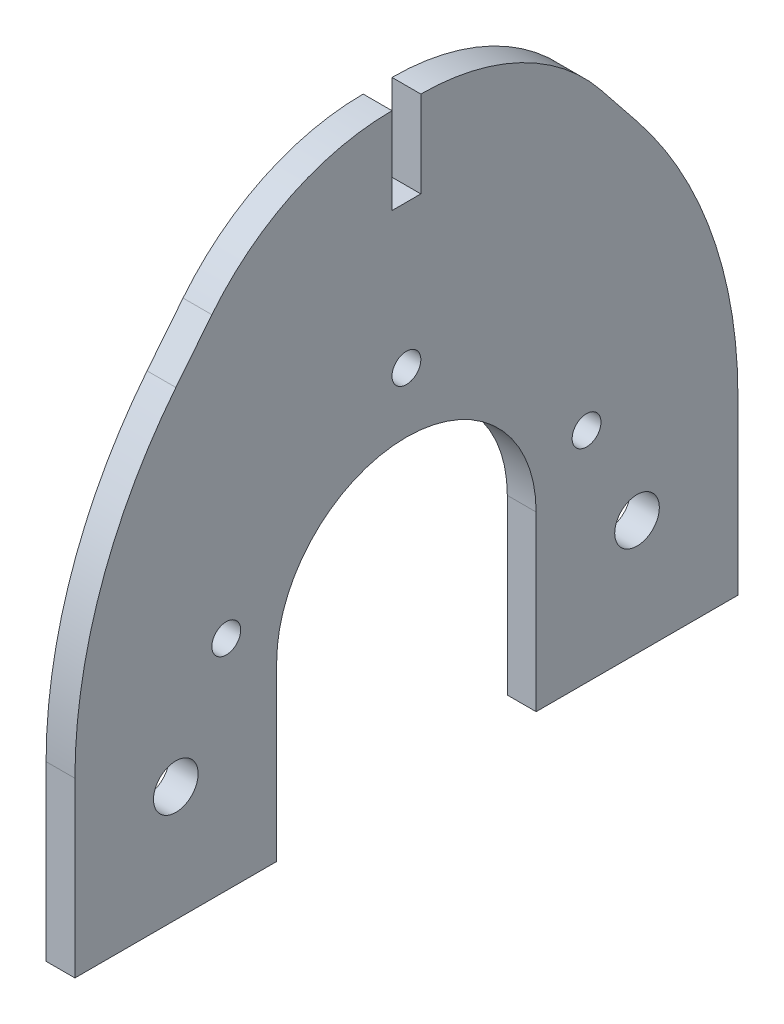
ISO-10303-21;
HEADER;
FILE_DESCRIPTION(('STEP AP214'),'2;1');
FILE_NAME('part.step','',(''),(''),'','','');
FILE_SCHEMA(('AUTOMOTIVE_DESIGN { 1 0 10303 214 1 1 1 1 }'));
ENDSEC;
DATA;
#1=APPLICATION_CONTEXT('core data for automotive mechanical design processes');
#2=APPLICATION_PROTOCOL_DEFINITION('international standard','automotive_design',2000,#1);
#3=PRODUCT_CONTEXT('',#1,'mechanical');
#4=PRODUCT('Part','Part','',(#3));
#5=PRODUCT_RELATED_PRODUCT_CATEGORY('part','',(#4));
#6=PRODUCT_DEFINITION_FORMATION('','',#4);
#7=PRODUCT_DEFINITION_CONTEXT('part definition',#1,'design');
#8=PRODUCT_DEFINITION('design','',#6,#7);
#9=PRODUCT_DEFINITION_SHAPE('','',#8);
#10=(LENGTH_UNIT() NAMED_UNIT(*) SI_UNIT(.MILLI.,.METRE.));
#11=(NAMED_UNIT(*) PLANE_ANGLE_UNIT() SI_UNIT($,.RADIAN.));
#12=(NAMED_UNIT(*) SI_UNIT($,.STERADIAN.) SOLID_ANGLE_UNIT());
#13=UNCERTAINTY_MEASURE_WITH_UNIT(LENGTH_MEASURE(1.E-05),#10,'distance_accuracy_value','');
#14=(GEOMETRIC_REPRESENTATION_CONTEXT(3) GLOBAL_UNCERTAINTY_ASSIGNED_CONTEXT((#13)) GLOBAL_UNIT_ASSIGNED_CONTEXT((#10,
#11,#12)) REPRESENTATION_CONTEXT('',''));
#15=CARTESIAN_POINT('',(0.,0.,0.));
#16=DIRECTION('',(0.,0.,1.));
#17=DIRECTION('',(1.,0.,0.));
#18=AXIS2_PLACEMENT_3D('',#15,#16,#17);
#19=CARTESIAN_POINT('',(3.175,0.,0.));
#20=DIRECTION('',(-1.,0.,0.));
#21=DIRECTION('',(0.,0.,1.));
#22=AXIS2_PLACEMENT_3D('',#19,#20,#21);
#23=CYLINDRICAL_SURFACE('',#22,14.2875);
#24=CARTESIAN_POINT('',(0.,0.,0.));
#25=DIRECTION('',(-1.,0.,0.));
#26=DIRECTION('',(0.,0.,-1.));
#27=AXIS2_PLACEMENT_3D('',#24,#25,#26);
#28=CIRCLE('',#27,14.2875);
#29=CARTESIAN_POINT('',(0.,0.,14.2875));
#30=VERTEX_POINT('',#29);
#31=CARTESIAN_POINT('',(0.,0.,-14.2875));
#32=VERTEX_POINT('',#31);
#33=EDGE_CURVE('E181',#30,#32,#28,.T.);
#34=ORIENTED_EDGE('',*,*,#33,.T.);
#35=DIRECTION('',(-1.,0.,0.));
#36=VECTOR('',#35,1.);
#37=CARTESIAN_POINT('',(3.175,0.,-14.2875));
#38=LINE('',#37,#36);
#39=CARTESIAN_POINT('',(3.175,0.,-14.2875));
#40=VERTEX_POINT('',#39);
#41=EDGE_CURVE('E11',#40,#32,#38,.T.);
#42=ORIENTED_EDGE('',*,*,#41,.F.);
#43=CARTESIAN_POINT('',(3.175,0.,0.));
#44=DIRECTION('',(-1.,0.,0.));
#45=DIRECTION('',(0.,0.,-1.));
#46=AXIS2_PLACEMENT_3D('',#43,#44,#45);
#47=CIRCLE('',#46,14.2875);
#48=CARTESIAN_POINT('',(3.175,0.,14.2875));
#49=VERTEX_POINT('',#48);
#50=EDGE_CURVE('E212',#49,#40,#47,.T.);
#51=ORIENTED_EDGE('',*,*,#50,.F.);
#52=DIRECTION('',(-1.,0.,0.));
#53=VECTOR('',#52,1.);
#54=CARTESIAN_POINT('',(3.175,0.,14.2875));
#55=LINE('',#54,#53);
#56=EDGE_CURVE('E177',#49,#30,#55,.T.);
#57=ORIENTED_EDGE('',*,*,#56,.T.);
#58=EDGE_LOOP('',(#34,#42,#51,#57));
#59=FACE_BOUND('',#58,.T.);
#60=ADVANCED_FACE('F37',(#59),#23,.F.);
#61=CARTESIAN_POINT('',(3.175,-19.05,-14.2875));
#62=DIRECTION('',(0.,0.,-1.));
#63=DIRECTION('',(-1.,0.,0.));
#64=AXIS2_PLACEMENT_3D('',#61,#62,#63);
#65=PLANE('',#64);
#66=DIRECTION('',(0.,-1.,0.));
#67=VECTOR('',#66,1.);
#68=CARTESIAN_POINT('',(0.,-19.05,-14.2875));
#69=LINE('',#68,#67);
#70=CARTESIAN_POINT('',(0.,-19.05,-14.2875));
#71=VERTEX_POINT('',#70);
#72=EDGE_CURVE('E184',#32,#71,#69,.T.);
#73=ORIENTED_EDGE('',*,*,#72,.T.);
#74=DIRECTION('',(-1.,0.,0.));
#75=VECTOR('',#74,1.);
#76=CARTESIAN_POINT('',(3.175,-19.05,-14.2875));
#77=LINE('',#76,#75);
#78=CARTESIAN_POINT('',(3.175,-19.05,-14.2875));
#79=VERTEX_POINT('',#78);
#80=EDGE_CURVE('E45',#79,#71,#77,.T.);
#81=ORIENTED_EDGE('',*,*,#80,.F.);
#82=DIRECTION('',(0.,-1.,0.));
#83=VECTOR('',#82,1.);
#84=CARTESIAN_POINT('',(3.175,-19.05,-14.2875));
#85=LINE('',#84,#83);
#86=EDGE_CURVE('E120',#40,#79,#85,.T.);
#87=ORIENTED_EDGE('',*,*,#86,.F.);
#88=ORIENTED_EDGE('',*,*,#41,.T.);
#89=EDGE_LOOP('',(#73,#81,#87,#88));
#90=FACE_BOUND('',#89,.T.);
#91=ADVANCED_FACE('F311',(#90),#65,.F.);
#92=CARTESIAN_POINT('',(3.175,-19.05,-36.5125));
#93=DIRECTION('',(0.,1.,0.));
#94=DIRECTION('',(0.,0.,1.));
#95=AXIS2_PLACEMENT_3D('',#92,#93,#94);
#96=PLANE('',#95);
#97=DIRECTION('',(0.,0.,-1.));
#98=VECTOR('',#97,1.);
#99=CARTESIAN_POINT('',(0.,-19.05,-36.5125));
#100=LINE('',#99,#98);
#101=CARTESIAN_POINT('',(0.,-19.05,-36.5125));
#102=VERTEX_POINT('',#101);
#103=EDGE_CURVE('E187',#71,#102,#100,.T.);
#104=ORIENTED_EDGE('',*,*,#103,.T.);
#105=DIRECTION('',(-1.,0.,0.));
#106=VECTOR('',#105,1.);
#107=CARTESIAN_POINT('',(3.175,-19.05,-36.5125));
#108=LINE('',#107,#106);
#109=CARTESIAN_POINT('',(3.175,-19.05,-36.5125));
#110=VERTEX_POINT('',#109);
#111=EDGE_CURVE('E243',#110,#102,#108,.T.);
#112=ORIENTED_EDGE('',*,*,#111,.F.);
#113=DIRECTION('',(0.,0.,-1.));
#114=VECTOR('',#113,1.);
#115=CARTESIAN_POINT('',(3.175,-19.05,-36.5125));
#116=LINE('',#115,#114);
#117=EDGE_CURVE('E251',#79,#110,#116,.T.);
#118=ORIENTED_EDGE('',*,*,#117,.F.);
#119=ORIENTED_EDGE('',*,*,#80,.T.);
#120=EDGE_LOOP('',(#104,#112,#118,#119));
#121=FACE_BOUND('',#120,.T.);
#122=ADVANCED_FACE('F249',(#121),#96,.F.);
#123=CARTESIAN_POINT('',(3.175,0.,-36.5125));
#124=DIRECTION('',(0.,0.,1.));
#125=DIRECTION('',(1.,0.,0.));
#126=AXIS2_PLACEMENT_3D('',#123,#124,#125);
#127=PLANE('',#126);
#128=DIRECTION('',(0.,1.,0.));
#129=VECTOR('',#128,1.);
#130=CARTESIAN_POINT('',(0.,0.,-36.5125));
#131=LINE('',#130,#129);
#132=CARTESIAN_POINT('',(0.,0.,-36.5125));
#133=VERTEX_POINT('',#132);
#134=EDGE_CURVE('E189',#102,#133,#131,.T.);
#135=ORIENTED_EDGE('',*,*,#134,.T.);
#136=DIRECTION('',(-1.,0.,0.));
#137=VECTOR('',#136,1.);
#138=CARTESIAN_POINT('',(3.175,0.,-36.5125));
#139=LINE('',#138,#137);
#140=CARTESIAN_POINT('',(3.175,0.,-36.5125));
#141=VERTEX_POINT('',#140);
#142=EDGE_CURVE('E240',#141,#133,#139,.T.);
#143=ORIENTED_EDGE('',*,*,#142,.F.);
#144=DIRECTION('',(0.,1.,0.));
#145=VECTOR('',#144,1.);
#146=CARTESIAN_POINT('',(3.175,0.,-36.5125));
#147=LINE('',#146,#145);
#148=EDGE_CURVE('E269',#110,#141,#147,.T.);
#149=ORIENTED_EDGE('',*,*,#148,.F.);
#150=ORIENTED_EDGE('',*,*,#111,.T.);
#151=EDGE_LOOP('',(#135,#143,#149,#150));
#152=FACE_BOUND('',#151,.T.);
#153=ADVANCED_FACE('F260',(#152),#127,.F.);
#154=CARTESIAN_POINT('',(3.175,0.,14.2875));
#155=DIRECTION('',(-1.,0.,0.));
#156=DIRECTION('',(0.,0.,1.));
#157=AXIS2_PLACEMENT_3D('',#154,#155,#156);
#158=CYLINDRICAL_SURFACE('',#157,50.8);
#159=CARTESIAN_POINT('',(0.,0.,14.2875));
#160=DIRECTION('',(1.,0.,0.));
#161=DIRECTION('',(0.,0.,-1.));
#162=AXIS2_PLACEMENT_3D('',#159,#160,#161);
#163=CIRCLE('',#162,50.8);
#164=CARTESIAN_POINT('',(0.,31.7197502393578,-25.3924375598395));
#165=VERTEX_POINT('',#164);
#166=EDGE_CURVE('E191',#133,#165,#163,.T.);
#167=ORIENTED_EDGE('',*,*,#166,.T.);
#168=DIRECTION('',(-1.,0.,0.));
#169=VECTOR('',#168,1.);
#170=CARTESIAN_POINT('',(3.175,31.7197502393578,-25.3924375598395));
#171=LINE('',#170,#169);
#172=CARTESIAN_POINT('',(3.175,31.7197502393578,-25.3924375598395));
#173=VERTEX_POINT('',#172);
#174=EDGE_CURVE('E237',#173,#165,#171,.T.);
#175=ORIENTED_EDGE('',*,*,#174,.F.);
#176=CARTESIAN_POINT('',(3.175,0.,14.2875));
#177=DIRECTION('',(1.,0.,0.));
#178=DIRECTION('',(0.,0.,-1.));
#179=AXIS2_PLACEMENT_3D('',#176,#177,#178);
#180=CIRCLE('',#179,50.8);
#181=EDGE_CURVE('E266',#141,#173,#180,.T.);
#182=ORIENTED_EDGE('',*,*,#181,.F.);
#183=ORIENTED_EDGE('',*,*,#142,.T.);
#184=EDGE_LOOP('',(#167,#175,#182,#183));
#185=FACE_BOUND('',#184,.T.);
#186=ADVANCED_FACE('F264',(#185),#158,.T.);
#187=CARTESIAN_POINT('',(3.175,36.6797424343378,-21.4274687799197));
#188=DIRECTION('',(0.,-0.624404532270824,0.781101133067706));
#189=DIRECTION('',(0.,-0.781101133067706,-0.624404532270824));
#190=AXIS2_PLACEMENT_3D('',#187,#188,#189);
#191=PLANE('',#190);
#192=DIRECTION('',(0.,0.781101133067706,0.624404532270824));
#193=VECTOR('',#192,1.);
#194=CARTESIAN_POINT('',(0.,36.6797424343378,-21.4274687799197));
#195=LINE('',#194,#193);
#196=CARTESIAN_POINT('',(0.,36.6797424343378,-21.4274687799197));
#197=VERTEX_POINT('',#196);
#198=EDGE_CURVE('E193',#165,#197,#195,.T.);
#199=ORIENTED_EDGE('',*,*,#198,.T.);
#200=DIRECTION('',(-1.,0.,0.));
#201=VECTOR('',#200,1.);
#202=CARTESIAN_POINT('',(3.175,36.6797424343378,-21.4274687799197));
#203=LINE('',#202,#201);
#204=CARTESIAN_POINT('',(3.175,36.6797424343378,-21.4274687799197));
#205=VERTEX_POINT('',#204);
#206=EDGE_CURVE('E234',#205,#197,#203,.T.);
#207=ORIENTED_EDGE('',*,*,#206,.F.);
#208=DIRECTION('',(0.,0.781101133067706,0.624404532270824));
#209=VECTOR('',#208,1.);
#210=CARTESIAN_POINT('',(3.175,36.6797424343378,-21.4274687799197));
#211=LINE('',#210,#209);
#212=EDGE_CURVE('E268',#173,#205,#211,.T.);
#213=ORIENTED_EDGE('',*,*,#212,.F.);
#214=ORIENTED_EDGE('',*,*,#174,.T.);
#215=EDGE_LOOP('',(#199,#207,#213,#214));
#216=FACE_BOUND('',#215,.T.);
#217=ADVANCED_FACE('F324',(#216),#191,.F.);
#218=CARTESIAN_POINT('',(3.175,20.8198673146589,-1.5875));
#219=DIRECTION('',(-1.,0.,0.));
#220=DIRECTION('',(0.,0.,1.));
#221=AXIS2_PLACEMENT_3D('',#218,#219,#220);
#222=CYLINDRICAL_SURFACE('',#221,25.4);
#223=CARTESIAN_POINT('',(0.,20.8198673146589,-1.5875));
#224=DIRECTION('',(1.,0.,0.));
#225=DIRECTION('',(0.,0.,-1.));
#226=AXIS2_PLACEMENT_3D('',#223,#224,#225);
#227=CIRCLE('',#226,25.4);
#228=CARTESIAN_POINT('',(0.,46.2198673146588,-1.5875));
#229=VERTEX_POINT('',#228);
#230=EDGE_CURVE('E195',#197,#229,#227,.T.);
#231=ORIENTED_EDGE('',*,*,#230,.T.);
#232=DIRECTION('',(-1.,0.,0.));
#233=VECTOR('',#232,1.);
#234=CARTESIAN_POINT('',(3.175,46.2198673146588,-1.5875));
#235=LINE('',#234,#233);
#236=CARTESIAN_POINT('',(3.175,46.2198673146588,-1.5875));
#237=VERTEX_POINT('',#236);
#238=EDGE_CURVE('E231',#237,#229,#235,.T.);
#239=ORIENTED_EDGE('',*,*,#238,.F.);
#240=CARTESIAN_POINT('',(3.175,20.8198673146589,-1.5875));
#241=DIRECTION('',(1.,0.,0.));
#242=DIRECTION('',(0.,0.,-1.));
#243=AXIS2_PLACEMENT_3D('',#240,#241,#242);
#244=CIRCLE('',#243,25.4);
#245=EDGE_CURVE('E271',#205,#237,#244,.T.);
#246=ORIENTED_EDGE('',*,*,#245,.F.);
#247=ORIENTED_EDGE('',*,*,#206,.T.);
#248=EDGE_LOOP('',(#231,#239,#246,#247));
#249=FACE_BOUND('',#248,.T.);
#250=ADVANCED_FACE('F327',(#249),#222,.T.);
#251=CARTESIAN_POINT('',(3.175,46.2198673146588,-1.5875));
#252=DIRECTION('',(0.,0.,-1.));
#253=DIRECTION('',(0.,1.,0.));
#254=AXIS2_PLACEMENT_3D('',#251,#252,#253);
#255=PLANE('',#254);
#256=DIRECTION('',(0.,-1.,0.));
#257=VECTOR('',#256,1.);
#258=CARTESIAN_POINT('',(0.,46.2198673146588,-1.5875));
#259=LINE('',#258,#257);
#260=CARTESIAN_POINT('',(0.,36.6948673146588,-1.5875));
#261=VERTEX_POINT('',#260);
#262=EDGE_CURVE('E197',#229,#261,#259,.T.);
#263=ORIENTED_EDGE('',*,*,#262,.T.);
#264=DIRECTION('',(-1.,0.,0.));
#265=VECTOR('',#264,1.);
#266=CARTESIAN_POINT('',(3.175,36.6948673146588,-1.5875));
#267=LINE('',#266,#265);
#268=CARTESIAN_POINT('',(3.175,36.6948673146588,-1.5875));
#269=VERTEX_POINT('',#268);
#270=EDGE_CURVE('E228',#269,#261,#267,.T.);
#271=ORIENTED_EDGE('',*,*,#270,.F.);
#272=DIRECTION('',(0.,-1.,0.));
#273=VECTOR('',#272,1.);
#274=CARTESIAN_POINT('',(3.175,46.2198673146588,-1.5875));
#275=LINE('',#274,#273);
#276=EDGE_CURVE('E277',#237,#269,#275,.T.);
#277=ORIENTED_EDGE('',*,*,#276,.F.);
#278=ORIENTED_EDGE('',*,*,#238,.T.);
#279=EDGE_LOOP('',(#263,#271,#277,#278));
#280=FACE_BOUND('',#279,.T.);
#281=ADVANCED_FACE('F331',(#280),#255,.F.);
#282=CARTESIAN_POINT('',(3.175,36.6948673146588,-1.5875));
#283=DIRECTION('',(0.,-1.,0.));
#284=DIRECTION('',(0.,0.,-1.));
#285=AXIS2_PLACEMENT_3D('',#282,#283,#284);
#286=PLANE('',#285);
#287=DIRECTION('',(0.,0.,1.));
#288=VECTOR('',#287,1.);
#289=CARTESIAN_POINT('',(0.,36.6948673146588,-1.5875));
#290=LINE('',#289,#288);
#291=CARTESIAN_POINT('',(0.,36.6948673146588,1.5875));
#292=VERTEX_POINT('',#291);
#293=EDGE_CURVE('E199',#261,#292,#290,.T.);
#294=ORIENTED_EDGE('',*,*,#293,.T.);
#295=DIRECTION('',(-1.,0.,0.));
#296=VECTOR('',#295,1.);
#297=CARTESIAN_POINT('',(3.175,36.6948673146588,1.5875));
#298=LINE('',#297,#296);
#299=CARTESIAN_POINT('',(3.175,36.6948673146588,1.5875));
#300=VERTEX_POINT('',#299);
#301=EDGE_CURVE('E225',#300,#292,#298,.T.);
#302=ORIENTED_EDGE('',*,*,#301,.F.);
#303=DIRECTION('',(0.,0.,1.));
#304=VECTOR('',#303,1.);
#305=CARTESIAN_POINT('',(3.175,36.6948673146588,-1.5875));
#306=LINE('',#305,#304);
#307=EDGE_CURVE('E279',#269,#300,#306,.T.);
#308=ORIENTED_EDGE('',*,*,#307,.F.);
#309=ORIENTED_EDGE('',*,*,#270,.T.);
#310=EDGE_LOOP('',(#294,#302,#308,#309));
#311=FACE_BOUND('',#310,.T.);
#312=ADVANCED_FACE('F335',(#311),#286,.F.);
#313=CARTESIAN_POINT('',(3.175,46.2198673146588,1.5875));
#314=DIRECTION('',(0.,0.,1.));
#315=DIRECTION('',(0.,-1.,0.));
#316=AXIS2_PLACEMENT_3D('',#313,#314,#315);
#317=PLANE('',#316);
#318=DIRECTION('',(0.,1.,0.));
#319=VECTOR('',#318,1.);
#320=CARTESIAN_POINT('',(0.,46.2198673146588,1.5875));
#321=LINE('',#320,#319);
#322=CARTESIAN_POINT('',(0.,46.2198673146588,1.5875));
#323=VERTEX_POINT('',#322);
#324=EDGE_CURVE('E201',#292,#323,#321,.T.);
#325=ORIENTED_EDGE('',*,*,#324,.T.);
#326=DIRECTION('',(-1.,0.,0.));
#327=VECTOR('',#326,1.);
#328=CARTESIAN_POINT('',(3.175,46.2198673146588,1.5875));
#329=LINE('',#328,#327);
#330=CARTESIAN_POINT('',(3.175,46.2198673146588,1.5875));
#331=VERTEX_POINT('',#330);
#332=EDGE_CURVE('E222',#331,#323,#329,.T.);
#333=ORIENTED_EDGE('',*,*,#332,.F.);
#334=DIRECTION('',(0.,1.,0.));
#335=VECTOR('',#334,1.);
#336=CARTESIAN_POINT('',(3.175,46.2198673146588,1.5875));
#337=LINE('',#336,#335);
#338=EDGE_CURVE('E281',#300,#331,#337,.T.);
#339=ORIENTED_EDGE('',*,*,#338,.F.);
#340=ORIENTED_EDGE('',*,*,#301,.T.);
#341=EDGE_LOOP('',(#325,#333,#339,#340));
#342=FACE_BOUND('',#341,.T.);
#343=ADVANCED_FACE('F339',(#342),#317,.F.);
#344=CARTESIAN_POINT('',(3.175,20.8198673146589,1.5875));
#345=DIRECTION('',(-1.,0.,0.));
#346=DIRECTION('',(0.,0.,1.));
#347=AXIS2_PLACEMENT_3D('',#344,#345,#346);
#348=CYLINDRICAL_SURFACE('',#347,25.4);
#349=CARTESIAN_POINT('',(0.,20.8198673146589,1.5875));
#350=DIRECTION('',(1.,0.,0.));
#351=DIRECTION('',(0.,0.,1.));
#352=AXIS2_PLACEMENT_3D('',#349,#350,#351);
#353=CIRCLE('',#352,25.4);
#354=CARTESIAN_POINT('',(0.,36.6797424343378,21.4274687799197));
#355=VERTEX_POINT('',#354);
#356=EDGE_CURVE('E203',#323,#355,#353,.T.);
#357=ORIENTED_EDGE('',*,*,#356,.T.);
#358=DIRECTION('',(-1.,0.,0.));
#359=VECTOR('',#358,1.);
#360=CARTESIAN_POINT('',(3.175,36.6797424343378,21.4274687799197));
#361=LINE('',#360,#359);
#362=CARTESIAN_POINT('',(3.175,36.6797424343378,21.4274687799197));
#363=VERTEX_POINT('',#362);
#364=EDGE_CURVE('E219',#363,#355,#361,.T.);
#365=ORIENTED_EDGE('',*,*,#364,.F.);
#366=CARTESIAN_POINT('',(3.175,20.8198673146589,1.5875));
#367=DIRECTION('',(1.,0.,0.));
#368=DIRECTION('',(0.,0.,1.));
#369=AXIS2_PLACEMENT_3D('',#366,#367,#368);
#370=CIRCLE('',#369,25.4);
#371=EDGE_CURVE('E283',#331,#363,#370,.T.);
#372=ORIENTED_EDGE('',*,*,#371,.F.);
#373=ORIENTED_EDGE('',*,*,#332,.T.);
#374=EDGE_LOOP('',(#357,#365,#372,#373));
#375=FACE_BOUND('',#374,.T.);
#376=ADVANCED_FACE('F343',(#375),#348,.T.);
#377=CARTESIAN_POINT('',(3.175,36.6797424343378,21.4274687799197));
#378=DIRECTION('',(0.,-0.624404532270824,-0.781101133067706));
#379=DIRECTION('',(0.,0.781101133067706,-0.624404532270824));
#380=AXIS2_PLACEMENT_3D('',#377,#378,#379);
#381=PLANE('',#380);
#382=DIRECTION('',(0.,-0.781101133067706,0.624404532270824));
#383=VECTOR('',#382,1.);
#384=CARTESIAN_POINT('',(0.,36.6797424343378,21.4274687799197));
#385=LINE('',#384,#383);
#386=CARTESIAN_POINT('',(0.,31.7197502393578,25.3924375598395));
#387=VERTEX_POINT('',#386);
#388=EDGE_CURVE('E205',#355,#387,#385,.T.);
#389=ORIENTED_EDGE('',*,*,#388,.T.);
#390=DIRECTION('',(-1.,0.,0.));
#391=VECTOR('',#390,1.);
#392=CARTESIAN_POINT('',(3.175,31.7197502393578,25.3924375598395));
#393=LINE('',#392,#391);
#394=CARTESIAN_POINT('',(3.175,31.7197502393578,25.3924375598395));
#395=VERTEX_POINT('',#394);
#396=EDGE_CURVE('E216',#395,#387,#393,.T.);
#397=ORIENTED_EDGE('',*,*,#396,.F.);
#398=DIRECTION('',(0.,-0.781101133067706,0.624404532270824));
#399=VECTOR('',#398,1.);
#400=CARTESIAN_POINT('',(3.175,36.6797424343378,21.4274687799197));
#401=LINE('',#400,#399);
#402=EDGE_CURVE('E285',#363,#395,#401,.T.);
#403=ORIENTED_EDGE('',*,*,#402,.F.);
#404=ORIENTED_EDGE('',*,*,#364,.T.);
#405=EDGE_LOOP('',(#389,#397,#403,#404));
#406=FACE_BOUND('',#405,.T.);
#407=ADVANCED_FACE('F291',(#406),#381,.F.);
#408=CARTESIAN_POINT('',(3.175,0.,-14.2875));
#409=DIRECTION('',(-1.,0.,0.));
#410=DIRECTION('',(0.,0.,1.));
#411=AXIS2_PLACEMENT_3D('',#408,#409,#410);
#412=CYLINDRICAL_SURFACE('',#411,50.8);
#413=CARTESIAN_POINT('',(0.,0.,-14.2875));
#414=DIRECTION('',(1.,0.,0.));
#415=DIRECTION('',(0.,0.,1.));
#416=AXIS2_PLACEMENT_3D('',#413,#414,#415);
#417=CIRCLE('',#416,50.8);
#418=CARTESIAN_POINT('',(0.,0.,36.5125));
#419=VERTEX_POINT('',#418);
#420=EDGE_CURVE('E207',#387,#419,#417,.T.);
#421=ORIENTED_EDGE('',*,*,#420,.T.);
#422=DIRECTION('',(-1.,0.,0.));
#423=VECTOR('',#422,1.);
#424=CARTESIAN_POINT('',(3.175,0.,36.5125));
#425=LINE('',#424,#423);
#426=CARTESIAN_POINT('',(3.175,0.,36.5125));
#427=VERTEX_POINT('',#426);
#428=EDGE_CURVE('E172',#427,#419,#425,.T.);
#429=ORIENTED_EDGE('',*,*,#428,.F.);
#430=CARTESIAN_POINT('',(3.175,0.,-14.2875));
#431=DIRECTION('',(1.,0.,0.));
#432=DIRECTION('',(0.,0.,1.));
#433=AXIS2_PLACEMENT_3D('',#430,#431,#432);
#434=CIRCLE('',#433,50.8);
#435=EDGE_CURVE('E163',#395,#427,#434,.T.);
#436=ORIENTED_EDGE('',*,*,#435,.F.);
#437=ORIENTED_EDGE('',*,*,#396,.T.);
#438=EDGE_LOOP('',(#421,#429,#436,#437));
#439=FACE_BOUND('',#438,.T.);
#440=ADVANCED_FACE('F295',(#439),#412,.T.);
#441=CARTESIAN_POINT('',(3.175,-19.05,36.5125));
#442=DIRECTION('',(0.,0.,-1.));
#443=DIRECTION('',(-1.,0.,0.));
#444=AXIS2_PLACEMENT_3D('',#441,#442,#443);
#445=PLANE('',#444);
#446=DIRECTION('',(0.,-1.,0.));
#447=VECTOR('',#446,1.);
#448=CARTESIAN_POINT('',(0.,-19.05,36.5125));
#449=LINE('',#448,#447);
#450=CARTESIAN_POINT('',(0.,-19.05,36.5125));
#451=VERTEX_POINT('',#450);
#452=EDGE_CURVE('E171',#419,#451,#449,.T.);
#453=ORIENTED_EDGE('',*,*,#452,.T.);
#454=DIRECTION('',(-1.,0.,0.));
#455=VECTOR('',#454,1.);
#456=CARTESIAN_POINT('',(3.175,-19.05,36.5125));
#457=LINE('',#456,#455);
#458=CARTESIAN_POINT('',(3.175,-19.05,36.5125));
#459=VERTEX_POINT('',#458);
#460=EDGE_CURVE('E168',#459,#451,#457,.T.);
#461=ORIENTED_EDGE('',*,*,#460,.F.);
#462=DIRECTION('',(0.,-1.,0.));
#463=VECTOR('',#462,1.);
#464=CARTESIAN_POINT('',(3.175,-19.05,36.5125));
#465=LINE('',#464,#463);
#466=EDGE_CURVE('E157',#427,#459,#465,.T.);
#467=ORIENTED_EDGE('',*,*,#466,.F.);
#468=ORIENTED_EDGE('',*,*,#428,.T.);
#469=EDGE_LOOP('',(#453,#461,#467,#468));
#470=FACE_BOUND('',#469,.T.);
#471=ADVANCED_FACE('F169',(#470),#445,.F.);
#472=CARTESIAN_POINT('',(3.175,-19.05,14.2875));
#473=DIRECTION('',(0.,1.,0.));
#474=DIRECTION('',(0.,0.,1.));
#475=AXIS2_PLACEMENT_3D('',#472,#473,#474);
#476=PLANE('',#475);
#477=DIRECTION('',(0.,0.,-1.));
#478=VECTOR('',#477,1.);
#479=CARTESIAN_POINT('',(0.,-19.05,14.2875));
#480=LINE('',#479,#478);
#481=CARTESIAN_POINT('',(0.,-19.05,14.2875));
#482=VERTEX_POINT('',#481);
#483=EDGE_CURVE('E106',#451,#482,#480,.T.);
#484=ORIENTED_EDGE('',*,*,#483,.T.);
#485=DIRECTION('',(-1.,0.,0.));
#486=VECTOR('',#485,1.);
#487=CARTESIAN_POINT('',(3.175,-19.05,14.2875));
#488=LINE('',#487,#486);
#489=CARTESIAN_POINT('',(3.175,-19.05,14.2875));
#490=VERTEX_POINT('',#489);
#491=EDGE_CURVE('E173',#490,#482,#488,.T.);
#492=ORIENTED_EDGE('',*,*,#491,.F.);
#493=DIRECTION('',(0.,0.,-1.));
#494=VECTOR('',#493,1.);
#495=CARTESIAN_POINT('',(3.175,-19.05,14.2875));
#496=LINE('',#495,#494);
#497=EDGE_CURVE('E161',#459,#490,#496,.T.);
#498=ORIENTED_EDGE('',*,*,#497,.F.);
#499=ORIENTED_EDGE('',*,*,#460,.T.);
#500=EDGE_LOOP('',(#484,#492,#498,#499));
#501=FACE_BOUND('',#500,.T.);
#502=ADVANCED_FACE('F175',(#501),#476,.F.);
#503=CARTESIAN_POINT('',(3.175,0.,14.2875));
#504=DIRECTION('',(0.,0.,1.));
#505=DIRECTION('',(1.,0.,0.));
#506=AXIS2_PLACEMENT_3D('',#503,#504,#505);
#507=PLANE('',#506);
#508=DIRECTION('',(0.,1.,0.));
#509=VECTOR('',#508,1.);
#510=CARTESIAN_POINT('',(0.,0.,14.2875));
#511=LINE('',#510,#509);
#512=EDGE_CURVE('E112',#482,#30,#511,.T.);
#513=ORIENTED_EDGE('',*,*,#512,.T.);
#514=ORIENTED_EDGE('',*,*,#56,.F.);
#515=DIRECTION('',(0.,1.,0.));
#516=VECTOR('',#515,1.);
#517=CARTESIAN_POINT('',(3.175,0.,14.2875));
#518=LINE('',#517,#516);
#519=EDGE_CURVE('E53',#490,#49,#518,.T.);
#520=ORIENTED_EDGE('',*,*,#519,.F.);
#521=ORIENTED_EDGE('',*,*,#491,.T.);
#522=EDGE_LOOP('',(#513,#514,#520,#521));
#523=FACE_BOUND('',#522,.T.);
#524=ADVANCED_FACE('F299',(#523),#507,.F.);
#525=CARTESIAN_POINT('',(3.175,0.,0.));
#526=DIRECTION('',(1.,0.,0.));
#527=DIRECTION('',(0.,0.,-1.));
#528=AXIS2_PLACEMENT_3D('',#525,#526,#527);
#529=PLANE('',#528);
#530=CARTESIAN_POINT('',(3.175,5.01649999999997,19.8426210219008));
#531=DIRECTION('',(1.,0.,0.));
#532=DIRECTION('',(0.,0.,-1.));
#533=AXIS2_PLACEMENT_3D('',#530,#531,#532);
#534=CIRCLE('',#533,1.5875);
#535=CARTESIAN_POINT('',(3.175,5.01649999999997,18.2551210219008));
#536=VERTEX_POINT('',#535);
#537=EDGE_CURVE('E559',#536,#536,#534,.T.);
#538=ORIENTED_EDGE('',*,*,#537,.F.);
#539=EDGE_LOOP('',(#538));
#540=FACE_BOUND('',#539,.T.);
#541=CARTESIAN_POINT('',(3.175,20.8915,0.));
#542=DIRECTION('',(1.,0.,0.));
#543=DIRECTION('',(0.,0.,-1.));
#544=AXIS2_PLACEMENT_3D('',#541,#542,#543);
#545=CIRCLE('',#544,1.58749999999995);
#546=CARTESIAN_POINT('',(3.175,20.8915,-1.5875));
#547=VERTEX_POINT('',#546);
#548=EDGE_CURVE('E560',#547,#547,#545,.T.);
#549=ORIENTED_EDGE('',*,*,#548,.F.);
#550=EDGE_LOOP('',(#549));
#551=FACE_BOUND('',#550,.T.);
#552=CARTESIAN_POINT('',(3.175,5.01649999999997,-19.8426210219009));
#553=DIRECTION('',(1.,0.,0.));
#554=DIRECTION('',(0.,0.,-1.));
#555=AXIS2_PLACEMENT_3D('',#552,#553,#554);
#556=CIRCLE('',#555,1.5875);
#557=CARTESIAN_POINT('',(3.175,5.01649999999997,-21.4301210219009));
#558=VERTEX_POINT('',#557);
#559=EDGE_CURVE('E570',#558,#558,#556,.T.);
#560=ORIENTED_EDGE('',*,*,#559,.F.);
#561=EDGE_LOOP('',(#560));
#562=FACE_BOUND('',#561,.T.);
#563=CARTESIAN_POINT('',(3.175,-6.35,-25.4));
#564=DIRECTION('',(1.,0.,0.));
#565=DIRECTION('',(0.,0.,-1.));
#566=AXIS2_PLACEMENT_3D('',#563,#564,#565);
#567=CIRCLE('',#566,2.45744999999999);
#568=CARTESIAN_POINT('',(3.175,-6.35,-27.85745));
#569=VERTEX_POINT('',#568);
#570=EDGE_CURVE('E578',#569,#569,#567,.T.);
#571=ORIENTED_EDGE('',*,*,#570,.F.);
#572=EDGE_LOOP('',(#571));
#573=FACE_BOUND('',#572,.T.);
#574=CARTESIAN_POINT('',(3.175,-6.34999999999999,25.4));
#575=DIRECTION('',(1.,0.,0.));
#576=DIRECTION('',(0.,0.,-1.));
#577=AXIS2_PLACEMENT_3D('',#574,#575,#576);
#578=CIRCLE('',#577,2.45744999999999);
#579=CARTESIAN_POINT('',(3.175,-6.34999999999999,22.94255));
#580=VERTEX_POINT('',#579);
#581=EDGE_CURVE('E185',#580,#580,#578,.T.);
#582=ORIENTED_EDGE('',*,*,#581,.F.);
#583=EDGE_LOOP('',(#582));
#584=FACE_BOUND('',#583,.T.);
#585=ORIENTED_EDGE('',*,*,#50,.T.);
#586=ORIENTED_EDGE('',*,*,#86,.T.);
#587=ORIENTED_EDGE('',*,*,#117,.T.);
#588=ORIENTED_EDGE('',*,*,#148,.T.);
#589=ORIENTED_EDGE('',*,*,#181,.T.);
#590=ORIENTED_EDGE('',*,*,#212,.T.);
#591=ORIENTED_EDGE('',*,*,#245,.T.);
#592=ORIENTED_EDGE('',*,*,#276,.T.);
#593=ORIENTED_EDGE('',*,*,#307,.T.);
#594=ORIENTED_EDGE('',*,*,#338,.T.);
#595=ORIENTED_EDGE('',*,*,#371,.T.);
#596=ORIENTED_EDGE('',*,*,#402,.T.);
#597=ORIENTED_EDGE('',*,*,#435,.T.);
#598=ORIENTED_EDGE('',*,*,#466,.T.);
#599=ORIENTED_EDGE('',*,*,#497,.T.);
#600=ORIENTED_EDGE('',*,*,#519,.T.);
#601=EDGE_LOOP('',(#585,#586,#587,#588,#589,#590,#591,#592,#593,#594,#595,#596,#597,#598,#599,#600));
#602=FACE_BOUND('',#601,.T.);
#603=ADVANCED_FACE('F159',(#540,#551,#562,#573,#584,#602),#529,.T.);
#604=CARTESIAN_POINT('',(0.,0.,0.));
#605=DIRECTION('',(1.,0.,0.));
#606=DIRECTION('',(0.,0.,-1.));
#607=AXIS2_PLACEMENT_3D('',#604,#605,#606);
#608=PLANE('',#607);
#609=CARTESIAN_POINT('',(0.,5.01649999999997,19.8426210219008));
#610=DIRECTION('',(1.,0.,0.));
#611=DIRECTION('',(0.,0.,-1.));
#612=AXIS2_PLACEMENT_3D('',#609,#610,#611);
#613=CIRCLE('',#612,1.5875);
#614=CARTESIAN_POINT('',(0.,5.01649999999997,18.2551210219008));
#615=VERTEX_POINT('',#614);
#616=EDGE_CURVE('E556',#615,#615,#613,.T.);
#617=ORIENTED_EDGE('',*,*,#616,.T.);
#618=EDGE_LOOP('',(#617));
#619=FACE_BOUND('',#618,.T.);
#620=CARTESIAN_POINT('',(0.,20.8915,0.));
#621=DIRECTION('',(1.,0.,0.));
#622=DIRECTION('',(0.,0.,-1.));
#623=AXIS2_PLACEMENT_3D('',#620,#621,#622);
#624=CIRCLE('',#623,1.58749999999995);
#625=CARTESIAN_POINT('',(0.,20.8915,-1.5875));
#626=VERTEX_POINT('',#625);
#627=EDGE_CURVE('E565',#626,#626,#624,.T.);
#628=ORIENTED_EDGE('',*,*,#627,.T.);
#629=EDGE_LOOP('',(#628));
#630=FACE_BOUND('',#629,.T.);
#631=CARTESIAN_POINT('',(0.,5.01649999999997,-19.8426210219009));
#632=DIRECTION('',(1.,0.,0.));
#633=DIRECTION('',(0.,0.,-1.));
#634=AXIS2_PLACEMENT_3D('',#631,#632,#633);
#635=CIRCLE('',#634,1.5875);
#636=CARTESIAN_POINT('',(0.,5.01649999999997,-21.4301210219009));
#637=VERTEX_POINT('',#636);
#638=EDGE_CURVE('E573',#637,#637,#635,.T.);
#639=ORIENTED_EDGE('',*,*,#638,.T.);
#640=EDGE_LOOP('',(#639));
#641=FACE_BOUND('',#640,.T.);
#642=CARTESIAN_POINT('',(0.,-6.35,-25.4));
#643=DIRECTION('',(-1.,0.,0.));
#644=DIRECTION('',(0.,0.,1.));
#645=AXIS2_PLACEMENT_3D('',#642,#643,#644);
#646=CIRCLE('',#645,2.45744999999999);
#647=CARTESIAN_POINT('',(0.,-6.35,-22.94255));
#648=VERTEX_POINT('',#647);
#649=EDGE_CURVE('E562',#648,#648,#646,.T.);
#650=ORIENTED_EDGE('',*,*,#649,.F.);
#651=EDGE_LOOP('',(#650));
#652=FACE_BOUND('',#651,.T.);
#653=CARTESIAN_POINT('',(0.,-6.34999999999999,25.4));
#654=DIRECTION('',(-1.,0.,0.));
#655=DIRECTION('',(0.,0.,1.));
#656=AXIS2_PLACEMENT_3D('',#653,#654,#655);
#657=CIRCLE('',#656,2.45744999999999);
#658=CARTESIAN_POINT('',(0.,-6.34999999999999,27.85745));
#659=VERTEX_POINT('',#658);
#660=EDGE_CURVE('E581',#659,#659,#657,.T.);
#661=ORIENTED_EDGE('',*,*,#660,.F.);
#662=EDGE_LOOP('',(#661));
#663=FACE_BOUND('',#662,.T.);
#664=ORIENTED_EDGE('',*,*,#33,.F.);
#665=ORIENTED_EDGE('',*,*,#512,.F.);
#666=ORIENTED_EDGE('',*,*,#483,.F.);
#667=ORIENTED_EDGE('',*,*,#452,.F.);
#668=ORIENTED_EDGE('',*,*,#420,.F.);
#669=ORIENTED_EDGE('',*,*,#388,.F.);
#670=ORIENTED_EDGE('',*,*,#356,.F.);
#671=ORIENTED_EDGE('',*,*,#324,.F.);
#672=ORIENTED_EDGE('',*,*,#293,.F.);
#673=ORIENTED_EDGE('',*,*,#262,.F.);
#674=ORIENTED_EDGE('',*,*,#230,.F.);
#675=ORIENTED_EDGE('',*,*,#198,.F.);
#676=ORIENTED_EDGE('',*,*,#166,.F.);
#677=ORIENTED_EDGE('',*,*,#134,.F.);
#678=ORIENTED_EDGE('',*,*,#103,.F.);
#679=ORIENTED_EDGE('',*,*,#72,.F.);
#680=EDGE_LOOP('',(#664,#665,#666,#667,#668,#669,#670,#671,#672,#673,#674,#675,#676,#677,#678,#679));
#681=FACE_BOUND('',#680,.T.);
#682=ADVANCED_FACE('F255',(#619,#630,#641,#652,#663,#681),#608,.F.);
#683=CARTESIAN_POINT('',(0.,-6.34999999999999,25.4));
#684=DIRECTION('',(-1.,0.,0.));
#685=DIRECTION('',(0.,0.,1.));
#686=AXIS2_PLACEMENT_3D('',#683,#684,#685);
#687=CYLINDRICAL_SURFACE('',#686,2.45744999999999);
#688=ORIENTED_EDGE('',*,*,#581,.T.);
#689=EDGE_LOOP('',(#688));
#690=FACE_BOUND('',#689,.T.);
#691=ORIENTED_EDGE('',*,*,#660,.T.);
#692=EDGE_LOOP('',(#691));
#693=FACE_BOUND('',#692,.T.);
#694=ADVANCED_FACE('F373',(#690,#693),#687,.F.);
#695=CARTESIAN_POINT('',(0.,-6.35,-25.4));
#696=DIRECTION('',(-1.,0.,0.));
#697=DIRECTION('',(0.,0.,1.));
#698=AXIS2_PLACEMENT_3D('',#695,#696,#697);
#699=CYLINDRICAL_SURFACE('',#698,2.45744999999999);
#700=ORIENTED_EDGE('',*,*,#570,.T.);
#701=EDGE_LOOP('',(#700));
#702=FACE_BOUND('',#701,.T.);
#703=ORIENTED_EDGE('',*,*,#649,.T.);
#704=EDGE_LOOP('',(#703));
#705=FACE_BOUND('',#704,.T.);
#706=ADVANCED_FACE('F378',(#702,#705),#699,.F.);
#707=CARTESIAN_POINT('',(0.,5.01649999999997,-19.8426210219009));
#708=DIRECTION('',(1.,0.,0.));
#709=DIRECTION('',(0.,0.,-1.));
#710=AXIS2_PLACEMENT_3D('',#707,#708,#709);
#711=CYLINDRICAL_SURFACE('',#710,1.5875);
#712=ORIENTED_EDGE('',*,*,#638,.F.);
#713=EDGE_LOOP('',(#712));
#714=FACE_BOUND('',#713,.T.);
#715=ORIENTED_EDGE('',*,*,#559,.T.);
#716=EDGE_LOOP('',(#715));
#717=FACE_BOUND('',#716,.T.);
#718=ADVANCED_FACE('F391',(#714,#717),#711,.F.);
#719=CARTESIAN_POINT('',(0.,20.8915,0.));
#720=DIRECTION('',(1.,0.,0.));
#721=DIRECTION('',(0.,0.,-1.));
#722=AXIS2_PLACEMENT_3D('',#719,#720,#721);
#723=CYLINDRICAL_SURFACE('',#722,1.58749999999995);
#724=ORIENTED_EDGE('',*,*,#627,.F.);
#725=EDGE_LOOP('',(#724));
#726=FACE_BOUND('',#725,.T.);
#727=ORIENTED_EDGE('',*,*,#548,.T.);
#728=EDGE_LOOP('',(#727));
#729=FACE_BOUND('',#728,.T.);
#730=ADVANCED_FACE('F415',(#726,#729),#723,.F.);
#731=CARTESIAN_POINT('',(0.,5.01649999999997,19.8426210219008));
#732=DIRECTION('',(1.,0.,0.));
#733=DIRECTION('',(0.,0.,-1.));
#734=AXIS2_PLACEMENT_3D('',#731,#732,#733);
#735=CYLINDRICAL_SURFACE('',#734,1.5875);
#736=ORIENTED_EDGE('',*,*,#616,.F.);
#737=EDGE_LOOP('',(#736));
#738=FACE_BOUND('',#737,.T.);
#739=ORIENTED_EDGE('',*,*,#537,.T.);
#740=EDGE_LOOP('',(#739));
#741=FACE_BOUND('',#740,.T.);
#742=ADVANCED_FACE('F426',(#738,#741),#735,.F.);
#743=CLOSED_SHELL('',(#60,#91,#122,#153,#186,#217,#250,#281,#312,#343,#376,#407,#440,#471,#502,
#524,#603,#682,#694,#706,#718,#730,#742));
#744=MANIFOLD_SOLID_BREP('B2',#743);
#745=ADVANCED_BREP_SHAPE_REPRESENTATION('',(#18,#744),#14);
#746=SHAPE_DEFINITION_REPRESENTATION(#9,#745);
ENDSEC;
END-ISO-10303-21;
